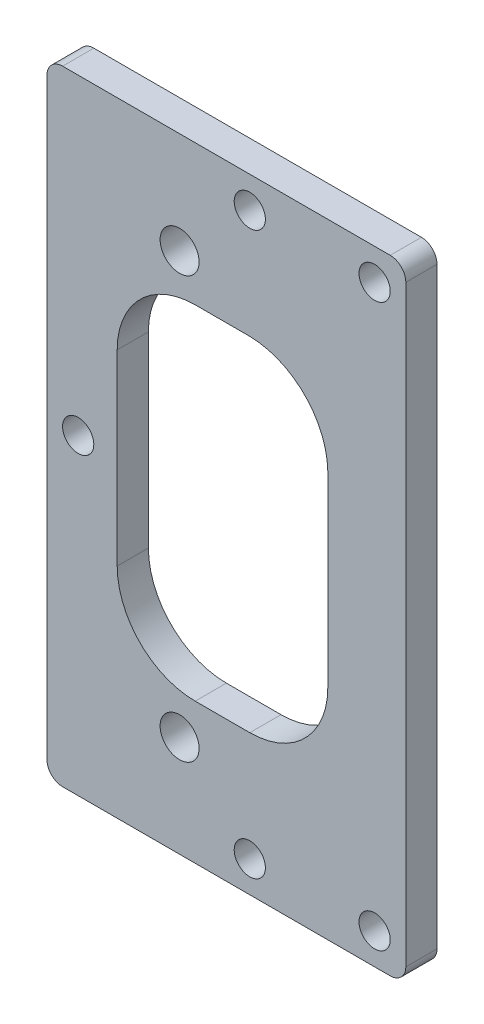
ISO-10303-21;
HEADER;
FILE_DESCRIPTION(('STEP AP214'),'2;1');
FILE_NAME('part.step','',(''),(''),'','','');
FILE_SCHEMA(('AUTOMOTIVE_DESIGN { 1 0 10303 214 1 1 1 1 }'));
ENDSEC;
DATA;
#1=APPLICATION_CONTEXT('core data for automotive mechanical design processes');
#2=APPLICATION_PROTOCOL_DEFINITION('international standard','automotive_design',2000,#1);
#3=PRODUCT_CONTEXT('',#1,'mechanical');
#4=PRODUCT('Part','Part','',(#3));
#5=PRODUCT_RELATED_PRODUCT_CATEGORY('part','',(#4));
#6=PRODUCT_DEFINITION_FORMATION('','',#4);
#7=PRODUCT_DEFINITION_CONTEXT('part definition',#1,'design');
#8=PRODUCT_DEFINITION('design','',#6,#7);
#9=PRODUCT_DEFINITION_SHAPE('','',#8);
#10=(LENGTH_UNIT() NAMED_UNIT(*) SI_UNIT(.MILLI.,.METRE.));
#11=(NAMED_UNIT(*) PLANE_ANGLE_UNIT() SI_UNIT($,.RADIAN.));
#12=(NAMED_UNIT(*) SI_UNIT($,.STERADIAN.) SOLID_ANGLE_UNIT());
#13=UNCERTAINTY_MEASURE_WITH_UNIT(LENGTH_MEASURE(1.E-05),#10,'distance_accuracy_value','');
#14=(GEOMETRIC_REPRESENTATION_CONTEXT(3) GLOBAL_UNCERTAINTY_ASSIGNED_CONTEXT((#13)) GLOBAL_UNIT_ASSIGNED_CONTEXT((#10,
#11,#12)) REPRESENTATION_CONTEXT('',''));
#15=CARTESIAN_POINT('',(0.,0.,0.));
#16=DIRECTION('',(0.,0.,1.));
#17=DIRECTION('',(1.,0.,0.));
#18=AXIS2_PLACEMENT_3D('',#15,#16,#17);
#19=CARTESIAN_POINT('',(0.,0.,2.));
#20=DIRECTION('',(0.,0.,1.));
#21=DIRECTION('',(1.,0.,0.));
#22=AXIS2_PLACEMENT_3D('',#19,#20,#21);
#23=PLANE('',#22);
#24=CARTESIAN_POINT('',(-12.7162131979419,-27.8375,2.));
#25=DIRECTION('',(0.,0.,1.));
#26=DIRECTION('',(1.,0.,0.));
#27=AXIS2_PLACEMENT_3D('',#24,#25,#26);
#28=CIRCLE('',#27,1.);
#29=CARTESIAN_POINT('',(-11.7162131979419,-27.8375,2.));
#30=VERTEX_POINT('',#29);
#31=EDGE_CURVE('E585',#30,#30,#28,.T.);
#32=ORIENTED_EDGE('',*,*,#31,.F.);
#33=EDGE_LOOP('',(#32));
#34=FACE_BOUND('',#33,.T.);
#35=CARTESIAN_POINT('',(-12.7162131979419,8.1625,2.));
#36=DIRECTION('',(0.,0.,1.));
#37=DIRECTION('',(1.,0.,0.));
#38=AXIS2_PLACEMENT_3D('',#35,#36,#37);
#39=CIRCLE('',#38,1.);
#40=CARTESIAN_POINT('',(-11.7162131979419,8.1625,2.));
#41=VERTEX_POINT('',#40);
#42=EDGE_CURVE('E593',#41,#41,#39,.T.);
#43=ORIENTED_EDGE('',*,*,#42,.F.);
#44=EDGE_LOOP('',(#43));
#45=FACE_BOUND('',#44,.T.);
#46=CARTESIAN_POINT('',(-4.71621319794188,8.1625,2.));
#47=DIRECTION('',(0.,0.,1.));
#48=DIRECTION('',(1.,0.,0.));
#49=AXIS2_PLACEMENT_3D('',#46,#47,#48);
#50=CIRCLE('',#49,1.);
#51=CARTESIAN_POINT('',(-3.71621319794188,8.1625,2.));
#52=VERTEX_POINT('',#51);
#53=EDGE_CURVE('E589',#52,#52,#50,.T.);
#54=ORIENTED_EDGE('',*,*,#53,.F.);
#55=EDGE_LOOP('',(#54));
#56=FACE_BOUND('',#55,.T.);
#57=CARTESIAN_POINT('',(-4.71621319794188,-27.8375,2.));
#58=DIRECTION('',(0.,0.,1.));
#59=DIRECTION('',(1.,0.,0.));
#60=AXIS2_PLACEMENT_3D('',#57,#58,#59);
#61=CIRCLE('',#60,1.);
#62=CARTESIAN_POINT('',(-3.71621319794188,-27.8375,2.));
#63=VERTEX_POINT('',#62);
#64=EDGE_CURVE('E179',#63,#63,#61,.T.);
#65=ORIENTED_EDGE('',*,*,#64,.F.);
#66=EDGE_LOOP('',(#65));
#67=FACE_BOUND('',#66,.T.);
#68=DIRECTION('',(1.,0.,0.));
#69=VECTOR('',#68,1.);
#70=CARTESIAN_POINT('',(-25.7162131979419,-29.8375,2.));
#71=LINE('',#70,#69);
#72=CARTESIAN_POINT('',(-24.7162131979419,-29.8375,2.));
#73=VERTEX_POINT('',#72);
#74=CARTESIAN_POINT('',(-3.71621319794188,-29.8375,2.));
#75=VERTEX_POINT('',#74);
#76=EDGE_CURVE('E252',#73,#75,#71,.T.);
#77=ORIENTED_EDGE('',*,*,#76,.T.);
#78=CARTESIAN_POINT('',(-3.71621319794188,-28.8375,2.));
#79=DIRECTION('',(0.,0.,1.));
#80=DIRECTION('',(1.,0.,0.));
#81=AXIS2_PLACEMENT_3D('',#78,#79,#80);
#82=CIRCLE('',#81,1.);
#83=CARTESIAN_POINT('',(-2.71621319794188,-28.8375,2.));
#84=VERTEX_POINT('',#83);
#85=EDGE_CURVE('E40',#75,#84,#82,.T.);
#86=ORIENTED_EDGE('',*,*,#85,.T.);
#87=DIRECTION('',(0.,1.,0.));
#88=VECTOR('',#87,1.);
#89=CARTESIAN_POINT('',(-2.71621319794187,1.16250000000001,2.));
#90=LINE('',#89,#88);
#91=CARTESIAN_POINT('',(-2.71621319794187,9.1625,2.));
#92=VERTEX_POINT('',#91);
#93=EDGE_CURVE('E226',#84,#92,#90,.T.);
#94=ORIENTED_EDGE('',*,*,#93,.T.);
#95=CARTESIAN_POINT('',(-3.71621319794187,9.1625,2.));
#96=DIRECTION('',(0.,0.,1.));
#97=DIRECTION('',(1.,0.,0.));
#98=AXIS2_PLACEMENT_3D('',#95,#96,#97);
#99=CIRCLE('',#98,1.);
#100=CARTESIAN_POINT('',(-3.71621319794187,10.1625,2.));
#101=VERTEX_POINT('',#100);
#102=EDGE_CURVE('E47',#92,#101,#99,.T.);
#103=ORIENTED_EDGE('',*,*,#102,.T.);
#104=DIRECTION('',(-1.,0.,0.));
#105=VECTOR('',#104,1.);
#106=CARTESIAN_POINT('',(15.2837868020581,10.1625,2.));
#107=LINE('',#106,#105);
#108=CARTESIAN_POINT('',(-24.7162131979419,10.1625,2.));
#109=VERTEX_POINT('',#108);
#110=EDGE_CURVE('E255',#101,#109,#107,.T.);
#111=ORIENTED_EDGE('',*,*,#110,.T.);
#112=CARTESIAN_POINT('',(-24.7162131979419,9.1625,2.));
#113=DIRECTION('',(0.,0.,1.));
#114=DIRECTION('',(1.,0.,0.));
#115=AXIS2_PLACEMENT_3D('',#112,#113,#114);
#116=CIRCLE('',#115,1.);
#117=CARTESIAN_POINT('',(-25.7162131979419,9.1625,2.));
#118=VERTEX_POINT('',#117);
#119=EDGE_CURVE('E270',#109,#118,#116,.T.);
#120=ORIENTED_EDGE('',*,*,#119,.T.);
#121=DIRECTION('',(0.,-1.,0.));
#122=VECTOR('',#121,1.);
#123=CARTESIAN_POINT('',(-25.7162131979419,10.1625,2.));
#124=LINE('',#123,#122);
#125=CARTESIAN_POINT('',(-25.7162131979419,-28.8375,2.));
#126=VERTEX_POINT('',#125);
#127=EDGE_CURVE('E249',#118,#126,#124,.T.);
#128=ORIENTED_EDGE('',*,*,#127,.T.);
#129=CARTESIAN_POINT('',(-24.7162131979419,-28.8375,2.));
#130=DIRECTION('',(0.,0.,1.));
#131=DIRECTION('',(1.,0.,0.));
#132=AXIS2_PLACEMENT_3D('',#129,#130,#131);
#133=CIRCLE('',#132,1.);
#134=EDGE_CURVE('E272',#126,#73,#133,.T.);
#135=ORIENTED_EDGE('',*,*,#134,.T.);
#136=EDGE_LOOP('',(#77,#86,#94,#103,#111,#120,#128,#135));
#137=FACE_BOUND('',#136,.T.);
#138=CARTESIAN_POINT('',(-12.7974631979419,-3.91875000000001,2.));
#139=DIRECTION('',(0.,0.,-1.));
#140=DIRECTION('',(1.,0.,0.));
#141=AXIS2_PLACEMENT_3D('',#138,#139,#140);
#142=CIRCLE('',#141,5.08189955872802);
#143=CARTESIAN_POINT('',(-12.7162131979419,1.1625,2.));
#144=VERTEX_POINT('',#143);
#145=CARTESIAN_POINT('',(-7.71621319794187,-3.8375,2.));
#146=VERTEX_POINT('',#145);
#147=EDGE_CURVE('E152',#144,#146,#142,.T.);
#148=ORIENTED_EDGE('',*,*,#147,.T.);
#149=DIRECTION('',(0.,-1.,0.));
#150=VECTOR('',#149,1.);
#151=CARTESIAN_POINT('',(-7.71621319794187,-3.8375,2.));
#152=LINE('',#151,#150);
#153=CARTESIAN_POINT('',(-7.71621319794188,-15.8375,2.));
#154=VERTEX_POINT('',#153);
#155=EDGE_CURVE('E164',#146,#154,#152,.T.);
#156=ORIENTED_EDGE('',*,*,#155,.T.);
#157=CARTESIAN_POINT('',(-12.7162131979419,-15.8375,2.));
#158=DIRECTION('',(0.,0.,-1.));
#159=DIRECTION('',(-1.,0.,0.));
#160=AXIS2_PLACEMENT_3D('',#157,#158,#159);
#161=CIRCLE('',#160,5.);
#162=CARTESIAN_POINT('',(-12.7162131979419,-20.8375,2.));
#163=VERTEX_POINT('',#162);
#164=EDGE_CURVE('E168',#154,#163,#161,.T.);
#165=ORIENTED_EDGE('',*,*,#164,.T.);
#166=DIRECTION('',(-1.,0.,0.));
#167=VECTOR('',#166,1.);
#168=CARTESIAN_POINT('',(-16.2162131979419,-20.8375,2.));
#169=LINE('',#168,#167);
#170=CARTESIAN_POINT('',(-16.2162131979419,-20.8375,2.));
#171=VERTEX_POINT('',#170);
#172=EDGE_CURVE('E183',#163,#171,#169,.T.);
#173=ORIENTED_EDGE('',*,*,#172,.T.);
#174=CARTESIAN_POINT('',(-16.2162131979419,-15.8375,2.));
#175=DIRECTION('',(0.,0.,-1.));
#176=DIRECTION('',(1.,0.,0.));
#177=AXIS2_PLACEMENT_3D('',#174,#175,#176);
#178=CIRCLE('',#177,5.);
#179=CARTESIAN_POINT('',(-21.2162131979419,-15.8375,2.));
#180=VERTEX_POINT('',#179);
#181=EDGE_CURVE('E186',#171,#180,#178,.T.);
#182=ORIENTED_EDGE('',*,*,#181,.T.);
#183=DIRECTION('',(0.,1.,0.));
#184=VECTOR('',#183,1.);
#185=CARTESIAN_POINT('',(-21.2162131979419,-3.8375,2.));
#186=LINE('',#185,#184);
#187=CARTESIAN_POINT('',(-21.2162131979419,-3.8375,2.));
#188=VERTEX_POINT('',#187);
#189=EDGE_CURVE('E189',#180,#188,#186,.T.);
#190=ORIENTED_EDGE('',*,*,#189,.T.);
#191=CARTESIAN_POINT('',(-16.2162131979419,-3.8375,2.));
#192=DIRECTION('',(0.,0.,-1.));
#193=DIRECTION('',(1.,0.,0.));
#194=AXIS2_PLACEMENT_3D('',#191,#192,#193);
#195=CIRCLE('',#194,5.);
#196=CARTESIAN_POINT('',(-16.2162131979419,1.1625,2.));
#197=VERTEX_POINT('',#196);
#198=EDGE_CURVE('E192',#188,#197,#195,.T.);
#199=ORIENTED_EDGE('',*,*,#198,.T.);
#200=DIRECTION('',(1.,0.,0.));
#201=VECTOR('',#200,1.);
#202=CARTESIAN_POINT('',(-12.7162131979419,1.1625,2.));
#203=LINE('',#202,#201);
#204=EDGE_CURVE('E160',#197,#144,#203,.T.);
#205=ORIENTED_EDGE('',*,*,#204,.T.);
#206=EDGE_LOOP('',(#148,#156,#165,#173,#182,#190,#199,#205));
#207=FACE_BOUND('',#206,.T.);
#208=CARTESIAN_POINT('',(-17.2162131979419,-23.3375,2.));
#209=DIRECTION('',(0.,0.,1.));
#210=DIRECTION('',(1.,0.,0.));
#211=AXIS2_PLACEMENT_3D('',#208,#209,#210);
#212=CIRCLE('',#211,1.25);
#213=CARTESIAN_POINT('',(-15.9662131979419,-23.3375,2.));
#214=VERTEX_POINT('',#213);
#215=EDGE_CURVE('E237',#214,#214,#212,.T.);
#216=ORIENTED_EDGE('',*,*,#215,.F.);
#217=EDGE_LOOP('',(#216));
#218=FACE_BOUND('',#217,.T.);
#219=CARTESIAN_POINT('',(-17.2162131979419,3.6625,2.));
#220=DIRECTION('',(0.,0.,1.));
#221=DIRECTION('',(1.,0.,0.));
#222=AXIS2_PLACEMENT_3D('',#219,#220,#221);
#223=CIRCLE('',#222,1.25);
#224=CARTESIAN_POINT('',(-15.9662131979419,3.6625,2.));
#225=VERTEX_POINT('',#224);
#226=EDGE_CURVE('E243',#225,#225,#223,.T.);
#227=ORIENTED_EDGE('',*,*,#226,.F.);
#228=EDGE_LOOP('',(#227));
#229=FACE_BOUND('',#228,.T.);
#230=CARTESIAN_POINT('',(-23.7162131979419,-9.8375,2.));
#231=DIRECTION('',(0.,0.,1.));
#232=DIRECTION('',(1.,0.,0.));
#233=AXIS2_PLACEMENT_3D('',#230,#231,#232);
#234=CIRCLE('',#233,1.);
#235=CARTESIAN_POINT('',(-22.7162131979419,-9.8375,2.));
#236=VERTEX_POINT('',#235);
#237=EDGE_CURVE('E231',#236,#236,#234,.T.);
#238=ORIENTED_EDGE('',*,*,#237,.F.);
#239=EDGE_LOOP('',(#238));
#240=FACE_BOUND('',#239,.T.);
#241=ADVANCED_FACE('F32',(#34,#45,#56,#67,#137,#207,#218,#229,#240),#23,.T.);
#242=CARTESIAN_POINT('',(0.,0.,0.));
#243=DIRECTION('',(0.,0.,1.));
#244=DIRECTION('',(1.,0.,0.));
#245=AXIS2_PLACEMENT_3D('',#242,#243,#244);
#246=PLANE('',#245);
#247=CARTESIAN_POINT('',(-12.7162131979419,-27.8375,0.));
#248=DIRECTION('',(0.,0.,-1.));
#249=DIRECTION('',(-1.,0.,0.));
#250=AXIS2_PLACEMENT_3D('',#247,#248,#249);
#251=CIRCLE('',#250,1.);
#252=CARTESIAN_POINT('',(-13.7162131979419,-27.8375,0.));
#253=VERTEX_POINT('',#252);
#254=EDGE_CURVE('E588',#253,#253,#251,.T.);
#255=ORIENTED_EDGE('',*,*,#254,.F.);
#256=EDGE_LOOP('',(#255));
#257=FACE_BOUND('',#256,.T.);
#258=CARTESIAN_POINT('',(-12.7162131979419,8.1625,0.));
#259=DIRECTION('',(0.,0.,-1.));
#260=DIRECTION('',(1.,0.,0.));
#261=AXIS2_PLACEMENT_3D('',#258,#259,#260);
#262=CIRCLE('',#261,1.);
#263=CARTESIAN_POINT('',(-11.7162131979419,8.1625,0.));
#264=VERTEX_POINT('',#263);
#265=EDGE_CURVE('E590',#264,#264,#262,.T.);
#266=ORIENTED_EDGE('',*,*,#265,.F.);
#267=EDGE_LOOP('',(#266));
#268=FACE_BOUND('',#267,.T.);
#269=CARTESIAN_POINT('',(-4.71621319794188,8.1625,0.));
#270=DIRECTION('',(0.,0.,-1.));
#271=DIRECTION('',(1.,0.,0.));
#272=AXIS2_PLACEMENT_3D('',#269,#270,#271);
#273=CIRCLE('',#272,1.);
#274=CARTESIAN_POINT('',(-3.71621319794188,8.1625,0.));
#275=VERTEX_POINT('',#274);
#276=EDGE_CURVE('E596',#275,#275,#273,.T.);
#277=ORIENTED_EDGE('',*,*,#276,.F.);
#278=EDGE_LOOP('',(#277));
#279=FACE_BOUND('',#278,.T.);
#280=CARTESIAN_POINT('',(-4.71621319794188,-27.8375,0.));
#281=DIRECTION('',(0.,0.,-1.));
#282=DIRECTION('',(-1.,0.,0.));
#283=AXIS2_PLACEMENT_3D('',#280,#281,#282);
#284=CIRCLE('',#283,1.);
#285=CARTESIAN_POINT('',(-5.71621319794188,-27.8375,0.));
#286=VERTEX_POINT('',#285);
#287=EDGE_CURVE('E603',#286,#286,#284,.T.);
#288=ORIENTED_EDGE('',*,*,#287,.F.);
#289=EDGE_LOOP('',(#288));
#290=FACE_BOUND('',#289,.T.);
#291=DIRECTION('',(0.,-1.,0.));
#292=VECTOR('',#291,1.);
#293=CARTESIAN_POINT('',(-7.71621319794187,-3.8375,0.));
#294=LINE('',#293,#292);
#295=CARTESIAN_POINT('',(-7.71621319794187,-3.8375,0.));
#296=VERTEX_POINT('',#295);
#297=CARTESIAN_POINT('',(-7.71621319794188,-15.8375,0.));
#298=VERTEX_POINT('',#297);
#299=EDGE_CURVE('E196',#296,#298,#294,.T.);
#300=ORIENTED_EDGE('',*,*,#299,.F.);
#301=CARTESIAN_POINT('',(-12.7974631979419,-3.91875000000001,0.));
#302=DIRECTION('',(0.,0.,-1.));
#303=DIRECTION('',(1.,0.,0.));
#304=AXIS2_PLACEMENT_3D('',#301,#302,#303);
#305=CIRCLE('',#304,5.08189955872802);
#306=CARTESIAN_POINT('',(-12.7162131979419,1.1625,0.));
#307=VERTEX_POINT('',#306);
#308=EDGE_CURVE('E155',#307,#296,#305,.T.);
#309=ORIENTED_EDGE('',*,*,#308,.F.);
#310=DIRECTION('',(1.,0.,0.));
#311=VECTOR('',#310,1.);
#312=CARTESIAN_POINT('',(-12.7162131979419,1.1625,0.));
#313=LINE('',#312,#311);
#314=CARTESIAN_POINT('',(-16.2162131979419,1.1625,0.));
#315=VERTEX_POINT('',#314);
#316=EDGE_CURVE('E173',#315,#307,#313,.T.);
#317=ORIENTED_EDGE('',*,*,#316,.F.);
#318=CARTESIAN_POINT('',(-16.2162131979419,-3.8375,0.));
#319=DIRECTION('',(0.,0.,-1.));
#320=DIRECTION('',(1.,0.,0.));
#321=AXIS2_PLACEMENT_3D('',#318,#319,#320);
#322=CIRCLE('',#321,5.);
#323=CARTESIAN_POINT('',(-21.2162131979419,-3.8375,0.));
#324=VERTEX_POINT('',#323);
#325=EDGE_CURVE('E176',#324,#315,#322,.T.);
#326=ORIENTED_EDGE('',*,*,#325,.F.);
#327=DIRECTION('',(0.,1.,0.));
#328=VECTOR('',#327,1.);
#329=CARTESIAN_POINT('',(-21.2162131979419,-3.8375,0.));
#330=LINE('',#329,#328);
#331=CARTESIAN_POINT('',(-21.2162131979419,-15.8375,0.));
#332=VERTEX_POINT('',#331);
#333=EDGE_CURVE('E207',#332,#324,#330,.T.);
#334=ORIENTED_EDGE('',*,*,#333,.F.);
#335=CARTESIAN_POINT('',(-16.2162131979419,-15.8375,0.));
#336=DIRECTION('',(0.,0.,-1.));
#337=DIRECTION('',(1.,0.,0.));
#338=AXIS2_PLACEMENT_3D('',#335,#336,#337);
#339=CIRCLE('',#338,5.);
#340=CARTESIAN_POINT('',(-16.2162131979419,-20.8375,0.));
#341=VERTEX_POINT('',#340);
#342=EDGE_CURVE('E204',#341,#332,#339,.T.);
#343=ORIENTED_EDGE('',*,*,#342,.F.);
#344=DIRECTION('',(-1.,0.,0.));
#345=VECTOR('',#344,1.);
#346=CARTESIAN_POINT('',(-16.2162131979419,-20.8375,0.));
#347=LINE('',#346,#345);
#348=CARTESIAN_POINT('',(-12.7162131979419,-20.8375,0.));
#349=VERTEX_POINT('',#348);
#350=EDGE_CURVE('E201',#349,#341,#347,.T.);
#351=ORIENTED_EDGE('',*,*,#350,.F.);
#352=CARTESIAN_POINT('',(-12.7162131979419,-15.8375,0.));
#353=DIRECTION('',(0.,0.,-1.));
#354=DIRECTION('',(-1.,0.,0.));
#355=AXIS2_PLACEMENT_3D('',#352,#353,#354);
#356=CIRCLE('',#355,5.);
#357=EDGE_CURVE('E198',#298,#349,#356,.T.);
#358=ORIENTED_EDGE('',*,*,#357,.F.);
#359=EDGE_LOOP('',(#300,#309,#317,#326,#334,#343,#351,#358));
#360=FACE_BOUND('',#359,.T.);
#361=DIRECTION('',(0.,1.,0.));
#362=VECTOR('',#361,1.);
#363=CARTESIAN_POINT('',(-2.71621319794187,1.16250000000001,0.));
#364=LINE('',#363,#362);
#365=CARTESIAN_POINT('',(-2.71621319794188,-28.8375,0.));
#366=VERTEX_POINT('',#365);
#367=CARTESIAN_POINT('',(-2.71621319794187,9.1625,0.));
#368=VERTEX_POINT('',#367);
#369=EDGE_CURVE('E214',#366,#368,#364,.T.);
#370=ORIENTED_EDGE('',*,*,#369,.F.);
#371=CARTESIAN_POINT('',(-3.71621319794188,-28.8375,0.));
#372=DIRECTION('',(0.,0.,1.));
#373=DIRECTION('',(1.,0.,0.));
#374=AXIS2_PLACEMENT_3D('',#371,#372,#373);
#375=CIRCLE('',#374,1.);
#376=CARTESIAN_POINT('',(-3.71621319794188,-29.8375,0.));
#377=VERTEX_POINT('',#376);
#378=EDGE_CURVE('E289',#366,#377,#375,.F.);
#379=ORIENTED_EDGE('',*,*,#378,.T.);
#380=DIRECTION('',(1.,0.,0.));
#381=VECTOR('',#380,1.);
#382=CARTESIAN_POINT('',(-25.7162131979419,-29.8375,0.));
#383=LINE('',#382,#381);
#384=CARTESIAN_POINT('',(-24.7162131979419,-29.8375,0.));
#385=VERTEX_POINT('',#384);
#386=EDGE_CURVE('E260',#385,#377,#383,.T.);
#387=ORIENTED_EDGE('',*,*,#386,.F.);
#388=CARTESIAN_POINT('',(-24.7162131979419,-28.8375,0.));
#389=DIRECTION('',(0.,0.,1.));
#390=DIRECTION('',(1.,0.,0.));
#391=AXIS2_PLACEMENT_3D('',#388,#389,#390);
#392=CIRCLE('',#391,1.);
#393=CARTESIAN_POINT('',(-25.7162131979419,-28.8375,0.));
#394=VERTEX_POINT('',#393);
#395=EDGE_CURVE('E265',#385,#394,#392,.F.);
#396=ORIENTED_EDGE('',*,*,#395,.T.);
#397=DIRECTION('',(0.,-1.,0.));
#398=VECTOR('',#397,1.);
#399=CARTESIAN_POINT('',(-25.7162131979419,10.1625,0.));
#400=LINE('',#399,#398);
#401=CARTESIAN_POINT('',(-25.7162131979419,9.1625,0.));
#402=VERTEX_POINT('',#401);
#403=EDGE_CURVE('E246',#402,#394,#400,.T.);
#404=ORIENTED_EDGE('',*,*,#403,.F.);
#405=CARTESIAN_POINT('',(-24.7162131979419,9.1625,0.));
#406=DIRECTION('',(0.,0.,1.));
#407=DIRECTION('',(1.,0.,0.));
#408=AXIS2_PLACEMENT_3D('',#405,#406,#407);
#409=CIRCLE('',#408,1.);
#410=CARTESIAN_POINT('',(-24.7162131979419,10.1625,0.));
#411=VERTEX_POINT('',#410);
#412=EDGE_CURVE('E257',#402,#411,#409,.F.);
#413=ORIENTED_EDGE('',*,*,#412,.T.);
#414=DIRECTION('',(-1.,0.,0.));
#415=VECTOR('',#414,1.);
#416=CARTESIAN_POINT('',(15.2837868020581,10.1625,0.));
#417=LINE('',#416,#415);
#418=CARTESIAN_POINT('',(-3.71621319794187,10.1625,0.));
#419=VERTEX_POINT('',#418);
#420=EDGE_CURVE('E253',#419,#411,#417,.T.);
#421=ORIENTED_EDGE('',*,*,#420,.F.);
#422=CARTESIAN_POINT('',(-3.71621319794187,9.1625,0.));
#423=DIRECTION('',(0.,0.,1.));
#424=DIRECTION('',(1.,0.,0.));
#425=AXIS2_PLACEMENT_3D('',#422,#423,#424);
#426=CIRCLE('',#425,1.);
#427=EDGE_CURVE('E287',#419,#368,#426,.F.);
#428=ORIENTED_EDGE('',*,*,#427,.T.);
#429=EDGE_LOOP('',(#370,#379,#387,#396,#404,#413,#421,#428));
#430=FACE_BOUND('',#429,.T.);
#431=CARTESIAN_POINT('',(-17.2162131979419,3.6625,0.));
#432=DIRECTION('',(0.,0.,1.));
#433=DIRECTION('',(1.,0.,0.));
#434=AXIS2_PLACEMENT_3D('',#431,#432,#433);
#435=CIRCLE('',#434,1.25);
#436=CARTESIAN_POINT('',(-15.9662131979419,3.6625,0.));
#437=VERTEX_POINT('',#436);
#438=EDGE_CURVE('E240',#437,#437,#435,.T.);
#439=ORIENTED_EDGE('',*,*,#438,.T.);
#440=EDGE_LOOP('',(#439));
#441=FACE_BOUND('',#440,.T.);
#442=CARTESIAN_POINT('',(-17.2162131979419,-23.3375,0.));
#443=DIRECTION('',(0.,0.,1.));
#444=DIRECTION('',(1.,0.,0.));
#445=AXIS2_PLACEMENT_3D('',#442,#443,#444);
#446=CIRCLE('',#445,1.25);
#447=CARTESIAN_POINT('',(-15.9662131979419,-23.3375,0.));
#448=VERTEX_POINT('',#447);
#449=EDGE_CURVE('E234',#448,#448,#446,.T.);
#450=ORIENTED_EDGE('',*,*,#449,.T.);
#451=EDGE_LOOP('',(#450));
#452=FACE_BOUND('',#451,.T.);
#453=CARTESIAN_POINT('',(-23.7162131979419,-9.8375,0.));
#454=DIRECTION('',(0.,0.,1.));
#455=DIRECTION('',(1.,0.,0.));
#456=AXIS2_PLACEMENT_3D('',#453,#454,#455);
#457=CIRCLE('',#456,1.);
#458=CARTESIAN_POINT('',(-22.7162131979419,-9.8375,0.));
#459=VERTEX_POINT('',#458);
#460=EDGE_CURVE('E228',#459,#459,#457,.T.);
#461=ORIENTED_EDGE('',*,*,#460,.T.);
#462=EDGE_LOOP('',(#461));
#463=FACE_BOUND('',#462,.T.);
#464=ADVANCED_FACE('F303',(#257,#268,#279,#290,#360,#430,#441,#452,#463),#246,.F.);
#465=CARTESIAN_POINT('',(-25.7162131979419,10.1625,2.));
#466=DIRECTION('',(1.,0.,0.));
#467=DIRECTION('',(0.,1.,0.));
#468=AXIS2_PLACEMENT_3D('',#465,#466,#467);
#469=PLANE('',#468);
#470=ORIENTED_EDGE('',*,*,#403,.T.);
#471=DIRECTION('',(0.,0.,-1.));
#472=VECTOR('',#471,1.);
#473=CARTESIAN_POINT('',(-25.7162131979419,-28.8375,2.));
#474=LINE('',#473,#472);
#475=EDGE_CURVE('E277',#394,#126,#474,.F.);
#476=ORIENTED_EDGE('',*,*,#475,.T.);
#477=ORIENTED_EDGE('',*,*,#127,.F.);
#478=DIRECTION('',(0.,0.,-1.));
#479=VECTOR('',#478,1.);
#480=CARTESIAN_POINT('',(-25.7162131979419,9.1625,2.));
#481=LINE('',#480,#479);
#482=EDGE_CURVE('E274',#118,#402,#481,.T.);
#483=ORIENTED_EDGE('',*,*,#482,.T.);
#484=EDGE_LOOP('',(#470,#476,#477,#483));
#485=FACE_BOUND('',#484,.T.);
#486=ADVANCED_FACE('F313',(#485),#469,.F.);
#487=CARTESIAN_POINT('',(-25.7162131979419,-29.8375,2.));
#488=DIRECTION('',(0.,1.,0.));
#489=DIRECTION('',(0.,0.,1.));
#490=AXIS2_PLACEMENT_3D('',#487,#488,#489);
#491=PLANE('',#490);
#492=ORIENTED_EDGE('',*,*,#386,.T.);
#493=DIRECTION('',(0.,0.,-1.));
#494=VECTOR('',#493,1.);
#495=CARTESIAN_POINT('',(-3.71621319794188,-29.8375,2.));
#496=LINE('',#495,#494);
#497=EDGE_CURVE('E55',#377,#75,#496,.F.);
#498=ORIENTED_EDGE('',*,*,#497,.T.);
#499=ORIENTED_EDGE('',*,*,#76,.F.);
#500=DIRECTION('',(0.,0.,-1.));
#501=VECTOR('',#500,1.);
#502=CARTESIAN_POINT('',(-24.7162131979419,-29.8375,2.));
#503=LINE('',#502,#501);
#504=EDGE_CURVE('E267',#73,#385,#503,.T.);
#505=ORIENTED_EDGE('',*,*,#504,.T.);
#506=EDGE_LOOP('',(#492,#498,#499,#505));
#507=FACE_BOUND('',#506,.T.);
#508=ADVANCED_FACE('F305',(#507),#491,.F.);
#509=CARTESIAN_POINT('',(15.2837868020581,10.1625,2.));
#510=DIRECTION('',(0.,-1.,0.));
#511=DIRECTION('',(0.,0.,-1.));
#512=AXIS2_PLACEMENT_3D('',#509,#510,#511);
#513=PLANE('',#512);
#514=ORIENTED_EDGE('',*,*,#110,.F.);
#515=DIRECTION('',(0.,0.,-1.));
#516=VECTOR('',#515,1.);
#517=CARTESIAN_POINT('',(-3.71621319794187,10.1625,2.));
#518=LINE('',#517,#516);
#519=EDGE_CURVE('E11',#101,#419,#518,.T.);
#520=ORIENTED_EDGE('',*,*,#519,.T.);
#521=ORIENTED_EDGE('',*,*,#420,.T.);
#522=DIRECTION('',(0.,0.,-1.));
#523=VECTOR('',#522,1.);
#524=CARTESIAN_POINT('',(-24.7162131979419,10.1625,2.));
#525=LINE('',#524,#523);
#526=EDGE_CURVE('E279',#411,#109,#525,.F.);
#527=ORIENTED_EDGE('',*,*,#526,.T.);
#528=EDGE_LOOP('',(#514,#520,#521,#527));
#529=FACE_BOUND('',#528,.T.);
#530=ADVANCED_FACE('F322',(#529),#513,.F.);
#531=CARTESIAN_POINT('',(-17.2162131979419,3.6625,2.));
#532=DIRECTION('',(0.,0.,-1.));
#533=DIRECTION('',(-1.,0.,0.));
#534=AXIS2_PLACEMENT_3D('',#531,#532,#533);
#535=CYLINDRICAL_SURFACE('',#534,1.25);
#536=ORIENTED_EDGE('',*,*,#226,.T.);
#537=EDGE_LOOP('',(#536));
#538=FACE_BOUND('',#537,.T.);
#539=ORIENTED_EDGE('',*,*,#438,.F.);
#540=EDGE_LOOP('',(#539));
#541=FACE_BOUND('',#540,.T.);
#542=ADVANCED_FACE('F345',(#538,#541),#535,.F.);
#543=CARTESIAN_POINT('',(-17.2162131979419,-23.3375,2.));
#544=DIRECTION('',(0.,0.,-1.));
#545=DIRECTION('',(-1.,0.,0.));
#546=AXIS2_PLACEMENT_3D('',#543,#544,#545);
#547=CYLINDRICAL_SURFACE('',#546,1.25);
#548=ORIENTED_EDGE('',*,*,#215,.T.);
#549=EDGE_LOOP('',(#548));
#550=FACE_BOUND('',#549,.T.);
#551=ORIENTED_EDGE('',*,*,#449,.F.);
#552=EDGE_LOOP('',(#551));
#553=FACE_BOUND('',#552,.T.);
#554=ADVANCED_FACE('F459',(#550,#553),#547,.F.);
#555=CARTESIAN_POINT('',(-23.7162131979419,-9.8375,2.));
#556=DIRECTION('',(0.,0.,-1.));
#557=DIRECTION('',(-1.,0.,0.));
#558=AXIS2_PLACEMENT_3D('',#555,#556,#557);
#559=CYLINDRICAL_SURFACE('',#558,1.);
#560=ORIENTED_EDGE('',*,*,#237,.T.);
#561=EDGE_LOOP('',(#560));
#562=FACE_BOUND('',#561,.T.);
#563=ORIENTED_EDGE('',*,*,#460,.F.);
#564=EDGE_LOOP('',(#563));
#565=FACE_BOUND('',#564,.T.);
#566=ADVANCED_FACE('F457',(#562,#565),#559,.F.);
#567=CARTESIAN_POINT('',(-2.71621319794187,1.16250000000001,2.));
#568=DIRECTION('',(-1.,0.,0.));
#569=DIRECTION('',(0.,-1.,0.));
#570=AXIS2_PLACEMENT_3D('',#567,#568,#569);
#571=PLANE('',#570);
#572=ORIENTED_EDGE('',*,*,#93,.F.);
#573=DIRECTION('',(0.,0.,-1.));
#574=VECTOR('',#573,1.);
#575=CARTESIAN_POINT('',(-2.71621319794188,-28.8375,2.));
#576=LINE('',#575,#574);
#577=EDGE_CURVE('E284',#84,#366,#576,.T.);
#578=ORIENTED_EDGE('',*,*,#577,.T.);
#579=ORIENTED_EDGE('',*,*,#369,.T.);
#580=DIRECTION('',(0.,0.,-1.));
#581=VECTOR('',#580,1.);
#582=CARTESIAN_POINT('',(-2.71621319794187,9.1625,2.));
#583=LINE('',#582,#581);
#584=EDGE_CURVE('E282',#368,#92,#583,.F.);
#585=ORIENTED_EDGE('',*,*,#584,.T.);
#586=EDGE_LOOP('',(#572,#578,#579,#585));
#587=FACE_BOUND('',#586,.T.);
#588=ADVANCED_FACE('F297',(#587),#571,.F.);
#589=CARTESIAN_POINT('',(-12.7974631979419,-3.91875000000001,2.));
#590=DIRECTION('',(0.,0.,-1.));
#591=DIRECTION('',(-1.,0.,0.));
#592=AXIS2_PLACEMENT_3D('',#589,#590,#591);
#593=CYLINDRICAL_SURFACE('',#592,5.08189955872802);
#594=ORIENTED_EDGE('',*,*,#308,.T.);
#595=DIRECTION('',(0.,0.,-1.));
#596=VECTOR('',#595,1.);
#597=CARTESIAN_POINT('',(-7.71621319794187,-3.8375,2.));
#598=LINE('',#597,#596);
#599=EDGE_CURVE('E148',#146,#296,#598,.T.);
#600=ORIENTED_EDGE('',*,*,#599,.F.);
#601=ORIENTED_EDGE('',*,*,#147,.F.);
#602=DIRECTION('',(0.,0.,-1.));
#603=VECTOR('',#602,1.);
#604=CARTESIAN_POINT('',(-12.7162131979419,1.1625,2.));
#605=LINE('',#604,#603);
#606=EDGE_CURVE('E212',#144,#307,#605,.T.);
#607=ORIENTED_EDGE('',*,*,#606,.T.);
#608=EDGE_LOOP('',(#594,#600,#601,#607));
#609=FACE_BOUND('',#608,.T.);
#610=ADVANCED_FACE('F150',(#609),#593,.F.);
#611=CARTESIAN_POINT('',(-12.7162131979419,1.1625,2.));
#612=DIRECTION('',(0.,1.,0.));
#613=DIRECTION('',(-1.,0.,0.));
#614=AXIS2_PLACEMENT_3D('',#611,#612,#613);
#615=PLANE('',#614);
#616=ORIENTED_EDGE('',*,*,#316,.T.);
#617=ORIENTED_EDGE('',*,*,#606,.F.);
#618=ORIENTED_EDGE('',*,*,#204,.F.);
#619=DIRECTION('',(0.,0.,-1.));
#620=VECTOR('',#619,1.);
#621=CARTESIAN_POINT('',(-16.2162131979419,1.1625,2.));
#622=LINE('',#621,#620);
#623=EDGE_CURVE('E215',#197,#315,#622,.T.);
#624=ORIENTED_EDGE('',*,*,#623,.T.);
#625=EDGE_LOOP('',(#616,#617,#618,#624));
#626=FACE_BOUND('',#625,.T.);
#627=ADVANCED_FACE('F429',(#626),#615,.F.);
#628=CARTESIAN_POINT('',(-16.2162131979419,-3.8375,2.));
#629=DIRECTION('',(0.,0.,-1.));
#630=DIRECTION('',(-1.,0.,0.));
#631=AXIS2_PLACEMENT_3D('',#628,#629,#630);
#632=CYLINDRICAL_SURFACE('',#631,5.);
#633=ORIENTED_EDGE('',*,*,#325,.T.);
#634=ORIENTED_EDGE('',*,*,#623,.F.);
#635=ORIENTED_EDGE('',*,*,#198,.F.);
#636=DIRECTION('',(0.,0.,-1.));
#637=VECTOR('',#636,1.);
#638=CARTESIAN_POINT('',(-21.2162131979419,-3.8375,2.));
#639=LINE('',#638,#637);
#640=EDGE_CURVE('E217',#188,#324,#639,.T.);
#641=ORIENTED_EDGE('',*,*,#640,.T.);
#642=EDGE_LOOP('',(#633,#634,#635,#641));
#643=FACE_BOUND('',#642,.T.);
#644=ADVANCED_FACE('F432',(#643),#632,.F.);
#645=CARTESIAN_POINT('',(-21.2162131979419,-3.8375,2.));
#646=DIRECTION('',(-1.,0.,0.));
#647=DIRECTION('',(0.,-1.,0.));
#648=AXIS2_PLACEMENT_3D('',#645,#646,#647);
#649=PLANE('',#648);
#650=ORIENTED_EDGE('',*,*,#333,.T.);
#651=ORIENTED_EDGE('',*,*,#640,.F.);
#652=ORIENTED_EDGE('',*,*,#189,.F.);
#653=DIRECTION('',(0.,0.,-1.));
#654=VECTOR('',#653,1.);
#655=CARTESIAN_POINT('',(-21.2162131979419,-15.8375,2.));
#656=LINE('',#655,#654);
#657=EDGE_CURVE('E219',#180,#332,#656,.T.);
#658=ORIENTED_EDGE('',*,*,#657,.T.);
#659=EDGE_LOOP('',(#650,#651,#652,#658));
#660=FACE_BOUND('',#659,.T.);
#661=ADVANCED_FACE('F436',(#660),#649,.F.);
#662=CARTESIAN_POINT('',(-16.2162131979419,-15.8375,2.));
#663=DIRECTION('',(0.,0.,-1.));
#664=DIRECTION('',(-1.,0.,0.));
#665=AXIS2_PLACEMENT_3D('',#662,#663,#664);
#666=CYLINDRICAL_SURFACE('',#665,5.);
#667=ORIENTED_EDGE('',*,*,#342,.T.);
#668=ORIENTED_EDGE('',*,*,#657,.F.);
#669=ORIENTED_EDGE('',*,*,#181,.F.);
#670=DIRECTION('',(0.,0.,-1.));
#671=VECTOR('',#670,1.);
#672=CARTESIAN_POINT('',(-16.2162131979419,-20.8375,2.));
#673=LINE('',#672,#671);
#674=EDGE_CURVE('E221',#171,#341,#673,.T.);
#675=ORIENTED_EDGE('',*,*,#674,.T.);
#676=EDGE_LOOP('',(#667,#668,#669,#675));
#677=FACE_BOUND('',#676,.T.);
#678=ADVANCED_FACE('F440',(#677),#666,.F.);
#679=CARTESIAN_POINT('',(-16.2162131979419,-20.8375,2.));
#680=DIRECTION('',(0.,-1.,0.));
#681=DIRECTION('',(1.,0.,0.));
#682=AXIS2_PLACEMENT_3D('',#679,#680,#681);
#683=PLANE('',#682);
#684=ORIENTED_EDGE('',*,*,#350,.T.);
#685=ORIENTED_EDGE('',*,*,#674,.F.);
#686=ORIENTED_EDGE('',*,*,#172,.F.);
#687=DIRECTION('',(0.,0.,-1.));
#688=VECTOR('',#687,1.);
#689=CARTESIAN_POINT('',(-12.7162131979419,-20.8375,2.));
#690=LINE('',#689,#688);
#691=EDGE_CURVE('E223',#163,#349,#690,.T.);
#692=ORIENTED_EDGE('',*,*,#691,.T.);
#693=EDGE_LOOP('',(#684,#685,#686,#692));
#694=FACE_BOUND('',#693,.T.);
#695=ADVANCED_FACE('F444',(#694),#683,.F.);
#696=CARTESIAN_POINT('',(-12.7162131979419,-15.8375,2.));
#697=DIRECTION('',(0.,0.,-1.));
#698=DIRECTION('',(-1.,0.,0.));
#699=AXIS2_PLACEMENT_3D('',#696,#697,#698);
#700=CYLINDRICAL_SURFACE('',#699,5.);
#701=ORIENTED_EDGE('',*,*,#357,.T.);
#702=ORIENTED_EDGE('',*,*,#691,.F.);
#703=ORIENTED_EDGE('',*,*,#164,.F.);
#704=DIRECTION('',(0.,0.,-1.));
#705=VECTOR('',#704,1.);
#706=CARTESIAN_POINT('',(-7.71621319794188,-15.8375,2.));
#707=LINE('',#706,#705);
#708=EDGE_CURVE('E159',#154,#298,#707,.T.);
#709=ORIENTED_EDGE('',*,*,#708,.T.);
#710=EDGE_LOOP('',(#701,#702,#703,#709));
#711=FACE_BOUND('',#710,.T.);
#712=ADVANCED_FACE('F448',(#711),#700,.F.);
#713=CARTESIAN_POINT('',(-7.71621319794187,-3.8375,2.));
#714=DIRECTION('',(1.,0.,0.));
#715=DIRECTION('',(0.,1.,0.));
#716=AXIS2_PLACEMENT_3D('',#713,#714,#715);
#717=PLANE('',#716);
#718=ORIENTED_EDGE('',*,*,#299,.T.);
#719=ORIENTED_EDGE('',*,*,#708,.F.);
#720=ORIENTED_EDGE('',*,*,#155,.F.);
#721=ORIENTED_EDGE('',*,*,#599,.T.);
#722=EDGE_LOOP('',(#718,#719,#720,#721));
#723=FACE_BOUND('',#722,.T.);
#724=ADVANCED_FACE('F165',(#723),#717,.F.);
#725=CARTESIAN_POINT('',(-24.7162131979419,-28.8375,2.));
#726=DIRECTION('',(0.,0.,-1.));
#727=DIRECTION('',(-1.,0.,0.));
#728=AXIS2_PLACEMENT_3D('',#725,#726,#727);
#729=CYLINDRICAL_SURFACE('',#728,1.);
#730=ORIENTED_EDGE('',*,*,#134,.F.);
#731=ORIENTED_EDGE('',*,*,#475,.F.);
#732=ORIENTED_EDGE('',*,*,#395,.F.);
#733=ORIENTED_EDGE('',*,*,#504,.F.);
#734=EDGE_LOOP('',(#730,#731,#732,#733));
#735=FACE_BOUND('',#734,.T.);
#736=ADVANCED_FACE('F309',(#735),#729,.T.);
#737=CARTESIAN_POINT('',(-24.7162131979419,9.1625,2.));
#738=DIRECTION('',(0.,0.,-1.));
#739=DIRECTION('',(-1.,0.,0.));
#740=AXIS2_PLACEMENT_3D('',#737,#738,#739);
#741=CYLINDRICAL_SURFACE('',#740,1.);
#742=ORIENTED_EDGE('',*,*,#119,.F.);
#743=ORIENTED_EDGE('',*,*,#526,.F.);
#744=ORIENTED_EDGE('',*,*,#412,.F.);
#745=ORIENTED_EDGE('',*,*,#482,.F.);
#746=EDGE_LOOP('',(#742,#743,#744,#745));
#747=FACE_BOUND('',#746,.T.);
#748=ADVANCED_FACE('F318',(#747),#741,.T.);
#749=CARTESIAN_POINT('',(-3.71621319794188,-28.8375,2.));
#750=DIRECTION('',(0.,0.,-1.));
#751=DIRECTION('',(-1.,0.,0.));
#752=AXIS2_PLACEMENT_3D('',#749,#750,#751);
#753=CYLINDRICAL_SURFACE('',#752,1.);
#754=ORIENTED_EDGE('',*,*,#85,.F.);
#755=ORIENTED_EDGE('',*,*,#497,.F.);
#756=ORIENTED_EDGE('',*,*,#378,.F.);
#757=ORIENTED_EDGE('',*,*,#577,.F.);
#758=EDGE_LOOP('',(#754,#755,#756,#757));
#759=FACE_BOUND('',#758,.T.);
#760=ADVANCED_FACE('F300',(#759),#753,.T.);
#761=CARTESIAN_POINT('',(-3.71621319794187,9.1625,2.));
#762=DIRECTION('',(0.,0.,-1.));
#763=DIRECTION('',(-1.,0.,0.));
#764=AXIS2_PLACEMENT_3D('',#761,#762,#763);
#765=CYLINDRICAL_SURFACE('',#764,1.);
#766=ORIENTED_EDGE('',*,*,#102,.F.);
#767=ORIENTED_EDGE('',*,*,#584,.F.);
#768=ORIENTED_EDGE('',*,*,#427,.F.);
#769=ORIENTED_EDGE('',*,*,#519,.F.);
#770=EDGE_LOOP('',(#766,#767,#768,#769));
#771=FACE_BOUND('',#770,.T.);
#772=ADVANCED_FACE('F34',(#771),#765,.T.);
#773=CARTESIAN_POINT('',(-4.71621319794188,-27.8375,10.));
#774=DIRECTION('',(0.,0.,-1.));
#775=DIRECTION('',(-1.,0.,0.));
#776=AXIS2_PLACEMENT_3D('',#773,#774,#775);
#777=CYLINDRICAL_SURFACE('',#776,1.);
#778=ORIENTED_EDGE('',*,*,#64,.T.);
#779=EDGE_LOOP('',(#778));
#780=FACE_BOUND('',#779,.T.);
#781=ORIENTED_EDGE('',*,*,#287,.T.);
#782=EDGE_LOOP('',(#781));
#783=FACE_BOUND('',#782,.T.);
#784=ADVANCED_FACE('F326',(#780,#783),#777,.F.);
#785=CARTESIAN_POINT('',(-4.71621319794188,8.1625,10.));
#786=DIRECTION('',(0.,0.,-1.));
#787=DIRECTION('',(-1.,0.,0.));
#788=AXIS2_PLACEMENT_3D('',#785,#786,#787);
#789=CYLINDRICAL_SURFACE('',#788,1.);
#790=ORIENTED_EDGE('',*,*,#53,.T.);
#791=EDGE_LOOP('',(#790));
#792=FACE_BOUND('',#791,.T.);
#793=ORIENTED_EDGE('',*,*,#276,.T.);
#794=EDGE_LOOP('',(#793));
#795=FACE_BOUND('',#794,.T.);
#796=ADVANCED_FACE('F331',(#792,#795),#789,.F.);
#797=CARTESIAN_POINT('',(-12.7162131979419,8.1625,10.));
#798=DIRECTION('',(0.,0.,-1.));
#799=DIRECTION('',(-1.,0.,0.));
#800=AXIS2_PLACEMENT_3D('',#797,#798,#799);
#801=CYLINDRICAL_SURFACE('',#800,1.);
#802=ORIENTED_EDGE('',*,*,#42,.T.);
#803=EDGE_LOOP('',(#802));
#804=FACE_BOUND('',#803,.T.);
#805=ORIENTED_EDGE('',*,*,#265,.T.);
#806=EDGE_LOOP('',(#805));
#807=FACE_BOUND('',#806,.T.);
#808=ADVANCED_FACE('F402',(#804,#807),#801,.F.);
#809=CARTESIAN_POINT('',(-12.7162131979419,-27.8375,10.));
#810=DIRECTION('',(0.,0.,-1.));
#811=DIRECTION('',(-1.,0.,0.));
#812=AXIS2_PLACEMENT_3D('',#809,#810,#811);
#813=CYLINDRICAL_SURFACE('',#812,1.);
#814=ORIENTED_EDGE('',*,*,#31,.T.);
#815=EDGE_LOOP('',(#814));
#816=FACE_BOUND('',#815,.T.);
#817=ORIENTED_EDGE('',*,*,#254,.T.);
#818=EDGE_LOOP('',(#817));
#819=FACE_BOUND('',#818,.T.);
#820=ADVANCED_FACE('F412',(#816,#819),#813,.F.);
#821=CLOSED_SHELL('',(#241,#464,#486,#508,#530,#542,#554,#566,#588,#610,#627,#644,#661,#678,
#695,#712,#724,#736,#748,#760,#772,#784,#796,#808,#820));
#822=MANIFOLD_SOLID_BREP('B2',#821);
#823=ADVANCED_BREP_SHAPE_REPRESENTATION('',(#18,#822),#14);
#824=SHAPE_DEFINITION_REPRESENTATION(#9,#823);
ENDSEC;
END-ISO-10303-21;
